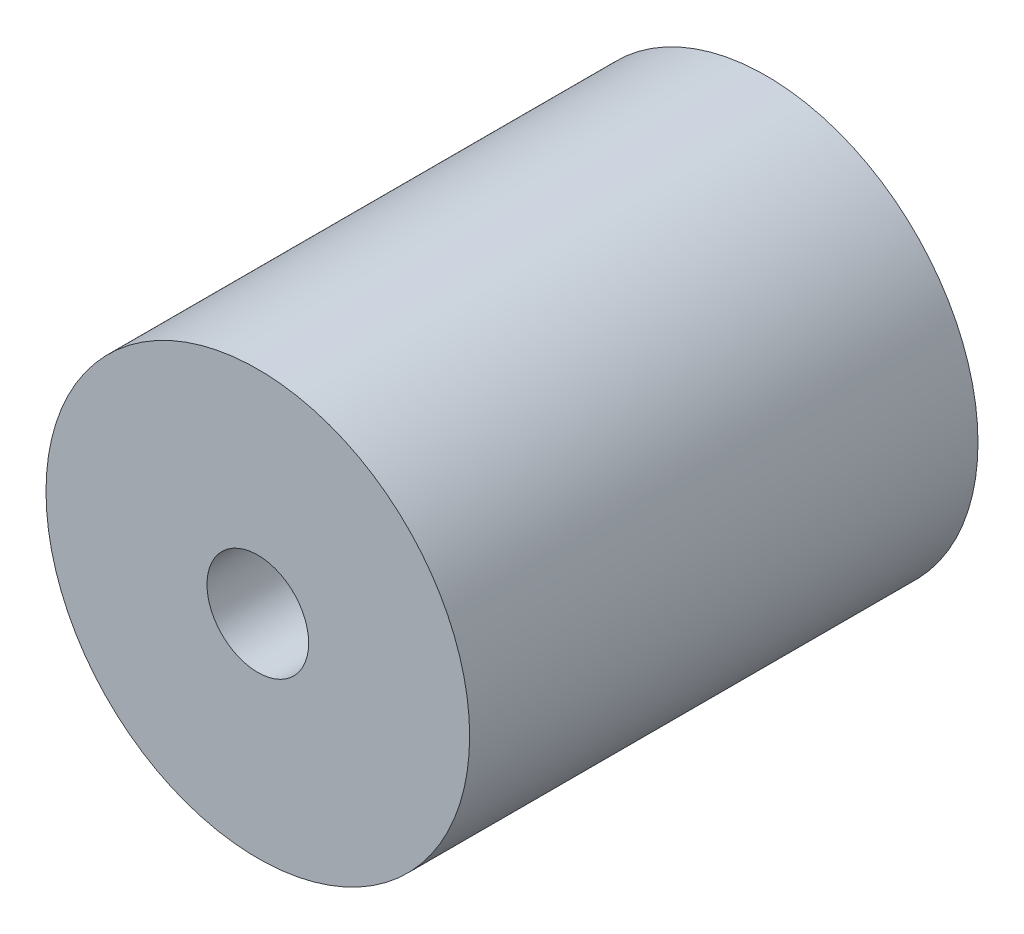
ISO-10303-21;
HEADER;
FILE_DESCRIPTION(('STEP AP214'),'2;1');
FILE_NAME('part.step','',(''),(''),'','','');
FILE_SCHEMA(('AUTOMOTIVE_DESIGN { 1 0 10303 214 1 1 1 1 }'));
ENDSEC;
DATA;
#1=APPLICATION_CONTEXT('core data for automotive mechanical design processes');
#2=APPLICATION_PROTOCOL_DEFINITION('international standard','automotive_design',2000,#1);
#3=PRODUCT_CONTEXT('',#1,'mechanical');
#4=PRODUCT('Part','Part','',(#3));
#5=PRODUCT_RELATED_PRODUCT_CATEGORY('part','',(#4));
#6=PRODUCT_DEFINITION_FORMATION('','',#4);
#7=PRODUCT_DEFINITION_CONTEXT('part definition',#1,'design');
#8=PRODUCT_DEFINITION('design','',#6,#7);
#9=PRODUCT_DEFINITION_SHAPE('','',#8);
#10=(LENGTH_UNIT() NAMED_UNIT(*) SI_UNIT(.MILLI.,.METRE.));
#11=(NAMED_UNIT(*) PLANE_ANGLE_UNIT() SI_UNIT($,.RADIAN.));
#12=(NAMED_UNIT(*) SI_UNIT($,.STERADIAN.) SOLID_ANGLE_UNIT());
#13=UNCERTAINTY_MEASURE_WITH_UNIT(LENGTH_MEASURE(1.E-05),#10,'distance_accuracy_value','');
#14=(GEOMETRIC_REPRESENTATION_CONTEXT(3) GLOBAL_UNCERTAINTY_ASSIGNED_CONTEXT((#13)) GLOBAL_UNIT_ASSIGNED_CONTEXT((#10,
#11,#12)) REPRESENTATION_CONTEXT('',''));
#15=CARTESIAN_POINT('',(0.,0.,0.));
#16=DIRECTION('',(0.,0.,1.));
#17=DIRECTION('',(1.,0.,0.));
#18=AXIS2_PLACEMENT_3D('',#15,#16,#17);
#19=CARTESIAN_POINT('',(0.,0.,-19.05));
#20=DIRECTION('',(0.,0.,1.));
#21=DIRECTION('',(1.,0.,0.));
#22=AXIS2_PLACEMENT_3D('',#19,#20,#21);
#23=CYLINDRICAL_SURFACE('',#22,15.875);
#24=CARTESIAN_POINT('',(0.,0.,-19.05));
#25=DIRECTION('',(0.,0.,1.));
#26=DIRECTION('',(1.,0.,0.));
#27=AXIS2_PLACEMENT_3D('',#24,#25,#26);
#28=CIRCLE('',#27,15.875);
#29=CARTESIAN_POINT('',(15.875,0.,-19.05));
#30=VERTEX_POINT('',#29);
#31=EDGE_CURVE('E10',#30,#30,#28,.T.);
#32=CARTESIAN_POINT('',(0.,0.,19.05));
#33=DIRECTION('',(0.,0.,1.));
#34=DIRECTION('',(1.,0.,0.));
#35=AXIS2_PLACEMENT_3D('',#32,#33,#34);
#36=CIRCLE('',#35,15.875);
#37=CARTESIAN_POINT('',(15.875,0.,19.05));
#38=VERTEX_POINT('',#37);
#39=EDGE_CURVE('E49',#38,#38,#36,.T.);
#40=CARTESIAN_POINT('',(15.875,0.,-19.05));
#41=CARTESIAN_POINT('',(15.875,0.,-18.653125));
#42=CARTESIAN_POINT('',(15.875,0.,-18.25625));
#43=CARTESIAN_POINT('',(15.875,0.,-17.4625));
#44=CARTESIAN_POINT('',(15.875,0.,-17.065625));
#45=CARTESIAN_POINT('',(15.875,0.,-16.271875));
#46=CARTESIAN_POINT('',(15.875,0.,-15.875));
#47=CARTESIAN_POINT('',(15.875,0.,-15.08125));
#48=CARTESIAN_POINT('',(15.875,0.,-14.684375));
#49=CARTESIAN_POINT('',(15.875,0.,-13.890625));
#50=CARTESIAN_POINT('',(15.875,0.,-13.49375));
#51=CARTESIAN_POINT('',(15.875,0.,-12.7));
#52=CARTESIAN_POINT('',(15.875,0.,-12.303125));
#53=CARTESIAN_POINT('',(15.875,0.,-11.509375));
#54=CARTESIAN_POINT('',(15.875,0.,-11.1125));
#55=CARTESIAN_POINT('',(15.875,0.,-10.31875));
#56=CARTESIAN_POINT('',(15.875,0.,-9.921875));
#57=CARTESIAN_POINT('',(15.875,0.,-9.128125));
#58=CARTESIAN_POINT('',(15.875,0.,-8.73125));
#59=CARTESIAN_POINT('',(15.875,0.,-7.9375));
#60=CARTESIAN_POINT('',(15.875,0.,-7.540625));
#61=CARTESIAN_POINT('',(15.875,0.,-6.746875));
#62=CARTESIAN_POINT('',(15.875,0.,-6.35));
#63=CARTESIAN_POINT('',(15.875,0.,-5.55625));
#64=CARTESIAN_POINT('',(15.875,0.,-5.159375));
#65=CARTESIAN_POINT('',(15.875,0.,-4.365625));
#66=CARTESIAN_POINT('',(15.875,0.,-3.96875));
#67=CARTESIAN_POINT('',(15.875,0.,-3.175));
#68=CARTESIAN_POINT('',(15.875,0.,-2.778125));
#69=CARTESIAN_POINT('',(15.875,0.,-1.984375));
#70=CARTESIAN_POINT('',(15.875,0.,-1.5875));
#71=CARTESIAN_POINT('',(15.875,0.,-0.793750000000004));
#72=CARTESIAN_POINT('',(15.875,0.,-0.396875000000004));
#73=CARTESIAN_POINT('',(15.875,0.,0.396874999999997));
#74=CARTESIAN_POINT('',(15.875,0.,0.793749999999997));
#75=CARTESIAN_POINT('',(15.875,0.,1.5875));
#76=CARTESIAN_POINT('',(15.875,0.,1.984375));
#77=CARTESIAN_POINT('',(15.875,0.,2.778125));
#78=CARTESIAN_POINT('',(15.875,0.,3.175));
#79=CARTESIAN_POINT('',(15.875,0.,3.96875));
#80=CARTESIAN_POINT('',(15.875,0.,4.365625));
#81=CARTESIAN_POINT('',(15.875,0.,5.159375));
#82=CARTESIAN_POINT('',(15.875,0.,5.55625));
#83=CARTESIAN_POINT('',(15.875,0.,6.35));
#84=CARTESIAN_POINT('',(15.875,0.,6.746875));
#85=CARTESIAN_POINT('',(15.875,0.,7.540625));
#86=CARTESIAN_POINT('',(15.875,0.,7.9375));
#87=CARTESIAN_POINT('',(15.875,0.,8.73125));
#88=CARTESIAN_POINT('',(15.875,0.,9.128125));
#89=CARTESIAN_POINT('',(15.875,0.,9.921875));
#90=CARTESIAN_POINT('',(15.875,0.,10.31875));
#91=CARTESIAN_POINT('',(15.875,0.,11.1125));
#92=CARTESIAN_POINT('',(15.875,0.,11.509375));
#93=CARTESIAN_POINT('',(15.875,0.,12.303125));
#94=CARTESIAN_POINT('',(15.875,0.,12.7));
#95=CARTESIAN_POINT('',(15.875,0.,13.49375));
#96=CARTESIAN_POINT('',(15.875,0.,13.890625));
#97=CARTESIAN_POINT('',(15.875,0.,14.684375));
#98=CARTESIAN_POINT('',(15.875,0.,15.08125));
#99=CARTESIAN_POINT('',(15.875,0.,15.875));
#100=CARTESIAN_POINT('',(15.875,0.,16.271875));
#101=CARTESIAN_POINT('',(15.875,0.,17.065625));
#102=CARTESIAN_POINT('',(15.875,0.,17.4625));
#103=CARTESIAN_POINT('',(15.875,0.,18.25625));
#104=CARTESIAN_POINT('',(15.875,0.,18.653125));
#105=CARTESIAN_POINT('',(15.875,0.,19.05));
#106=B_SPLINE_CURVE_WITH_KNOTS('',3,(#40,#41,#42,#43,#44,#45,#46,#47,#48,#49,#50,#51,#52,#53,
#54,#55,#56,#57,#58,#59,#60,#61,#62,#63,#64,#65,#66,#67,#68,#69,#70,#71,#72,#73,#74,#75,#76,#77,
#78,#79,#80,#81,#82,#83,#84,#85,#86,#87,#88,#89,#90,#91,#92,#93,#94,#95,#96,#97,#98,#99,#100,
#101,#102,#103,#104,#105),.UNSPECIFIED.,.F.,.F.,(4,2,2,2,2,2,2,2,2,2,2,2,2,2,2,2,2,2,2,2,2,2,2,
2,2,2,2,2,2,2,2,2,4),(0.,1.190625,2.38125,3.571875,4.7625,5.953125,7.14375,8.334375,9.525,
10.715625,11.90625,13.096875,14.2875,15.478125,16.66875,17.859375,19.05,20.240625,21.43125,
22.621875,23.8125,25.003125,26.19375,27.384375,28.575,29.765625,30.95625,32.146875,33.3375,
34.528125,35.71875,36.909375,38.1),.UNSPECIFIED.);
#107=EDGE_CURVE('BSEAM37',#30,#38,#106,.T.);
#108=ORIENTED_EDGE('',*,*,#31,.T.);
#109=ORIENTED_EDGE('',*,*,#39,.F.);
#110=ORIENTED_EDGE('',*,*,#107,.T.);
#111=ORIENTED_EDGE('',*,*,#107,.F.);
#112=EDGE_LOOP('',(#108,#110,#109,#111));
#113=FACE_BOUND('',#112,.T.);
#114=ADVANCED_FACE('F37',(#113),#23,.T.);
#115=CARTESIAN_POINT('',(0.,0.,-19.05));
#116=DIRECTION('',(0.,0.,1.));
#117=DIRECTION('',(1.,0.,0.));
#118=AXIS2_PLACEMENT_3D('',#115,#116,#117);
#119=PLANE('',#118);
#120=CARTESIAN_POINT('',(0.,0.,-19.05));
#121=DIRECTION('',(0.,0.,1.));
#122=DIRECTION('',(1.,0.,0.));
#123=AXIS2_PLACEMENT_3D('',#120,#121,#122);
#124=CIRCLE('',#123,3.81);
#125=CARTESIAN_POINT('',(3.81,0.,-19.05));
#126=VERTEX_POINT('',#125);
#127=EDGE_CURVE('E44',#126,#126,#124,.T.);
#128=ORIENTED_EDGE('',*,*,#127,.T.);
#129=EDGE_LOOP('',(#128));
#130=FACE_BOUND('',#129,.T.);
#131=ORIENTED_EDGE('',*,*,#31,.F.);
#132=EDGE_LOOP('',(#131));
#133=FACE_BOUND('',#132,.T.);
#134=ADVANCED_FACE('F70',(#130,#133),#119,.F.);
#135=CARTESIAN_POINT('',(0.,0.,-19.05));
#136=DIRECTION('',(0.,0.,1.));
#137=DIRECTION('',(1.,0.,0.));
#138=AXIS2_PLACEMENT_3D('',#135,#136,#137);
#139=CYLINDRICAL_SURFACE('',#138,3.81);
#140=CARTESIAN_POINT('',(0.,0.,19.05));
#141=DIRECTION('',(0.,0.,1.));
#142=DIRECTION('',(1.,0.,0.));
#143=AXIS2_PLACEMENT_3D('',#140,#141,#142);
#144=CIRCLE('',#143,3.81);
#145=CARTESIAN_POINT('',(3.81,0.,19.05));
#146=VERTEX_POINT('',#145);
#147=EDGE_CURVE('E54',#146,#146,#144,.T.);
#148=CARTESIAN_POINT('',(3.81,0.,-19.05));
#149=CARTESIAN_POINT('',(3.81,0.,-18.653125));
#150=CARTESIAN_POINT('',(3.81,0.,-18.25625));
#151=CARTESIAN_POINT('',(3.81,0.,-17.4625));
#152=CARTESIAN_POINT('',(3.81,0.,-17.065625));
#153=CARTESIAN_POINT('',(3.81,0.,-16.271875));
#154=CARTESIAN_POINT('',(3.81,0.,-15.875));
#155=CARTESIAN_POINT('',(3.81,0.,-15.08125));
#156=CARTESIAN_POINT('',(3.81,0.,-14.684375));
#157=CARTESIAN_POINT('',(3.81,0.,-13.890625));
#158=CARTESIAN_POINT('',(3.81,0.,-13.49375));
#159=CARTESIAN_POINT('',(3.81,0.,-12.7));
#160=CARTESIAN_POINT('',(3.81,0.,-12.303125));
#161=CARTESIAN_POINT('',(3.81,0.,-11.509375));
#162=CARTESIAN_POINT('',(3.81,0.,-11.1125));
#163=CARTESIAN_POINT('',(3.81,0.,-10.31875));
#164=CARTESIAN_POINT('',(3.81,0.,-9.921875));
#165=CARTESIAN_POINT('',(3.81,0.,-9.128125));
#166=CARTESIAN_POINT('',(3.81,0.,-8.73125));
#167=CARTESIAN_POINT('',(3.81,0.,-7.9375));
#168=CARTESIAN_POINT('',(3.81,0.,-7.540625));
#169=CARTESIAN_POINT('',(3.81,0.,-6.746875));
#170=CARTESIAN_POINT('',(3.81,0.,-6.35));
#171=CARTESIAN_POINT('',(3.81,0.,-5.55625));
#172=CARTESIAN_POINT('',(3.81,0.,-5.159375));
#173=CARTESIAN_POINT('',(3.81,0.,-4.365625));
#174=CARTESIAN_POINT('',(3.81,0.,-3.96875));
#175=CARTESIAN_POINT('',(3.81,0.,-3.175));
#176=CARTESIAN_POINT('',(3.81,0.,-2.778125));
#177=CARTESIAN_POINT('',(3.81,0.,-1.984375));
#178=CARTESIAN_POINT('',(3.81,0.,-1.5875));
#179=CARTESIAN_POINT('',(3.81,0.,-0.793750000000004));
#180=CARTESIAN_POINT('',(3.81,0.,-0.396875000000004));
#181=CARTESIAN_POINT('',(3.81,0.,0.396874999999997));
#182=CARTESIAN_POINT('',(3.81,0.,0.793749999999997));
#183=CARTESIAN_POINT('',(3.81,0.,1.5875));
#184=CARTESIAN_POINT('',(3.81,0.,1.984375));
#185=CARTESIAN_POINT('',(3.81,0.,2.778125));
#186=CARTESIAN_POINT('',(3.81,0.,3.175));
#187=CARTESIAN_POINT('',(3.81,0.,3.96875));
#188=CARTESIAN_POINT('',(3.81,0.,4.365625));
#189=CARTESIAN_POINT('',(3.81,0.,5.159375));
#190=CARTESIAN_POINT('',(3.81,0.,5.55625));
#191=CARTESIAN_POINT('',(3.81,0.,6.35));
#192=CARTESIAN_POINT('',(3.81,0.,6.746875));
#193=CARTESIAN_POINT('',(3.81,0.,7.540625));
#194=CARTESIAN_POINT('',(3.81,0.,7.9375));
#195=CARTESIAN_POINT('',(3.81,0.,8.73125));
#196=CARTESIAN_POINT('',(3.81,0.,9.128125));
#197=CARTESIAN_POINT('',(3.81,0.,9.921875));
#198=CARTESIAN_POINT('',(3.81,0.,10.31875));
#199=CARTESIAN_POINT('',(3.81,0.,11.1125));
#200=CARTESIAN_POINT('',(3.81,0.,11.509375));
#201=CARTESIAN_POINT('',(3.81,0.,12.303125));
#202=CARTESIAN_POINT('',(3.81,0.,12.7));
#203=CARTESIAN_POINT('',(3.81,0.,13.49375));
#204=CARTESIAN_POINT('',(3.81,0.,13.890625));
#205=CARTESIAN_POINT('',(3.81,0.,14.684375));
#206=CARTESIAN_POINT('',(3.81,0.,15.08125));
#207=CARTESIAN_POINT('',(3.81,0.,15.875));
#208=CARTESIAN_POINT('',(3.81,0.,16.271875));
#209=CARTESIAN_POINT('',(3.81,0.,17.065625));
#210=CARTESIAN_POINT('',(3.81,0.,17.4625));
#211=CARTESIAN_POINT('',(3.81,0.,18.25625));
#212=CARTESIAN_POINT('',(3.81,0.,18.653125));
#213=CARTESIAN_POINT('',(3.81,0.,19.05));
#214=B_SPLINE_CURVE_WITH_KNOTS('',3,(#148,#149,#150,#151,#152,#153,#154,#155,#156,#157,#158,
#159,#160,#161,#162,#163,#164,#165,#166,#167,#168,#169,#170,#171,#172,#173,#174,#175,#176,#177,
#178,#179,#180,#181,#182,#183,#184,#185,#186,#187,#188,#189,#190,#191,#192,#193,#194,#195,#196,
#197,#198,#199,#200,#201,#202,#203,#204,#205,#206,#207,#208,#209,#210,#211,#212,#213),
.UNSPECIFIED.,.F.,.F.,(4,2,2,2,2,2,2,2,2,2,2,2,2,2,2,2,2,2,2,2,2,2,2,2,2,2,2,2,2,2,2,2,4),(0.,
1.190625,2.38125,3.571875,4.7625,5.953125,7.14375,8.334375,9.525,10.715625,11.90625,13.096875,
14.2875,15.478125,16.66875,17.859375,19.05,20.240625,21.43125,22.621875,23.8125,25.003125,
26.19375,27.384375,28.575,29.765625,30.95625,32.146875,33.3375,34.528125,35.71875,36.909375,
38.1),.UNSPECIFIED.);
#215=EDGE_CURVE('BSEAM61',#126,#146,#214,.T.);
#216=ORIENTED_EDGE('',*,*,#127,.F.);
#217=ORIENTED_EDGE('',*,*,#147,.T.);
#218=ORIENTED_EDGE('',*,*,#215,.T.);
#219=ORIENTED_EDGE('',*,*,#215,.F.);
#220=EDGE_LOOP('',(#216,#218,#217,#219));
#221=FACE_BOUND('',#220,.T.);
#222=ADVANCED_FACE('F61',(#221),#139,.F.);
#223=CARTESIAN_POINT('',(0.,0.,19.05));
#224=DIRECTION('',(0.,0.,1.));
#225=DIRECTION('',(1.,0.,0.));
#226=AXIS2_PLACEMENT_3D('',#223,#224,#225);
#227=PLANE('',#226);
#228=ORIENTED_EDGE('',*,*,#39,.T.);
#229=EDGE_LOOP('',(#228));
#230=FACE_BOUND('',#229,.T.);
#231=ORIENTED_EDGE('',*,*,#147,.F.);
#232=EDGE_LOOP('',(#231));
#233=FACE_BOUND('',#232,.T.);
#234=ADVANCED_FACE('F63',(#230,#233),#227,.T.);
#235=CLOSED_SHELL('',(#114,#134,#222,#234));
#236=MANIFOLD_SOLID_BREP('B2',#235);
#237=ADVANCED_BREP_SHAPE_REPRESENTATION('',(#18,#236),#14);
#238=SHAPE_DEFINITION_REPRESENTATION(#9,#237);
ENDSEC;
END-ISO-10303-21;
